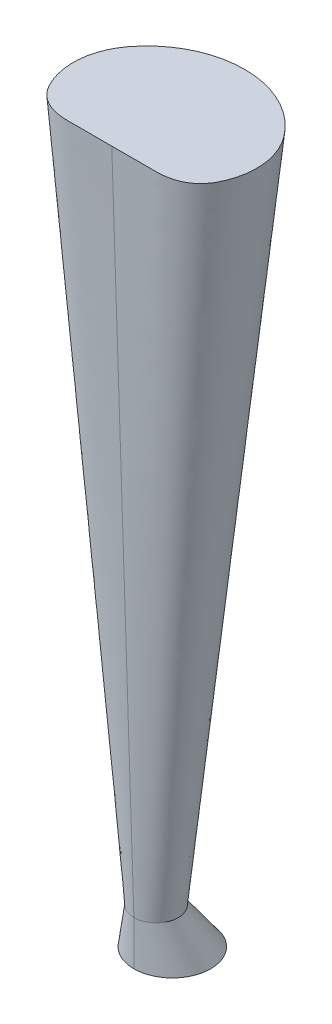
ISO-10303-21;
HEADER;
FILE_DESCRIPTION(('STEP AP214'),'2;1');
FILE_NAME('part.step','',(''),(''),'','','');
FILE_SCHEMA(('AUTOMOTIVE_DESIGN { 1 0 10303 214 1 1 1 1 }'));
ENDSEC;
DATA;
#1=APPLICATION_CONTEXT('core data for automotive mechanical design processes');
#2=APPLICATION_PROTOCOL_DEFINITION('international standard','automotive_design',2000,#1);
#3=PRODUCT_CONTEXT('',#1,'mechanical');
#4=PRODUCT('Part','Part','',(#3));
#5=PRODUCT_RELATED_PRODUCT_CATEGORY('part','',(#4));
#6=PRODUCT_DEFINITION_FORMATION('','',#4);
#7=PRODUCT_DEFINITION_CONTEXT('part definition',#1,'design');
#8=PRODUCT_DEFINITION('design','',#6,#7);
#9=PRODUCT_DEFINITION_SHAPE('','',#8);
#10=(LENGTH_UNIT() NAMED_UNIT(*) SI_UNIT(.MILLI.,.METRE.));
#11=(NAMED_UNIT(*) PLANE_ANGLE_UNIT() SI_UNIT($,.RADIAN.));
#12=(NAMED_UNIT(*) SI_UNIT($,.STERADIAN.) SOLID_ANGLE_UNIT());
#13=UNCERTAINTY_MEASURE_WITH_UNIT(LENGTH_MEASURE(1.E-05),#10,'distance_accuracy_value','');
#14=(GEOMETRIC_REPRESENTATION_CONTEXT(3) GLOBAL_UNCERTAINTY_ASSIGNED_CONTEXT((#13)) GLOBAL_UNIT_ASSIGNED_CONTEXT((#10,
#11,#12)) REPRESENTATION_CONTEXT('',''));
#15=CARTESIAN_POINT('',(0.,0.,0.));
#16=DIRECTION('',(0.,0.,1.));
#17=DIRECTION('',(1.,0.,0.));
#18=AXIS2_PLACEMENT_3D('',#15,#16,#17);
#19=CARTESIAN_POINT('',(66.8999862803839,273.793581868622,-23.9760529932259));
#20=DIRECTION('',(0.,1.,0.));
#21=DIRECTION('',(0.,0.,1.));
#22=AXIS2_PLACEMENT_3D('',#19,#20,#21);
#23=PLANE('',#22);
#24=DIRECTION('',(1.,0.,0.));
#25=VECTOR('',#24,1.);
#26=CARTESIAN_POINT('',(-1.37196160818359E-05,273.793581868622,65.2239470067741));
#27=LINE('',#26,#25);
#28=CARTESIAN_POINT('',(-1.37196160818359E-05,273.793581868622,65.2239470067741));
#29=VERTEX_POINT('',#28);
#30=CARTESIAN_POINT('',(66.8999862804511,273.793581868622,65.2239470067741));
#31=VERTEX_POINT('',#30);
#32=EDGE_CURVE('E496',#29,#31,#27,.T.);
#33=ORIENTED_EDGE('',*,*,#32,.T.);
#34=CARTESIAN_POINT('',(66.8999862803839,273.793581868622,-23.9760529932259));
#35=DIRECTION('',(0.,1.,0.));
#36=DIRECTION('',(0.,0.,1.));
#37=AXIS2_PLACEMENT_3D('',#34,#35,#36);
#38=CIRCLE('',#37,89.2);
#39=CARTESIAN_POINT('',(90.6681218430752,273.793581868622,61.9990348629289));
#40=VERTEX_POINT('',#39);
#41=EDGE_CURVE('E170',#31,#40,#38,.T.);
#42=ORIENTED_EDGE('',*,*,#41,.T.);
#43=CARTESIAN_POINT('',(75.218833727268,273.793581868622,6.11522775644428));
#44=DIRECTION('',(0.,1.,0.));
#45=DIRECTION('',(0.,0.,1.));
#46=AXIS2_PLACEMENT_3D('',#43,#44,#45);
#47=CIRCLE('',#46,57.98);
#48=CARTESIAN_POINT('',(126.250033132228,273.793581868622,33.6378927308106));
#49=VERTEX_POINT('',#48);
#50=EDGE_CURVE('E176',#40,#49,#47,.T.);
#51=ORIENTED_EDGE('',*,*,#50,.T.);
#52=CARTESIAN_POINT('',(35.964064954307,273.793581868622,-15.0560529932259));
#53=DIRECTION('',(0.,1.,0.));
#54=DIRECTION('',(0.,0.,1.));
#55=AXIS2_PLACEMENT_3D('',#52,#53,#54);
#56=CIRCLE('',#55,102.58);
#57=CARTESIAN_POINT('',(118.028537187502,273.793581868622,-76.6034233439338));
#58=VERTEX_POINT('',#57);
#59=EDGE_CURVE('E470',#49,#58,#56,.T.);
#60=ORIENTED_EDGE('',*,*,#59,.T.);
#61=CARTESIAN_POINT('',(0.283859635532339,273.793581868622,11.7036732462201));
#62=DIRECTION('',(0.,1.,0.));
#63=DIRECTION('',(0.,0.,1.));
#64=AXIS2_PLACEMENT_3D('',#61,#62,#63);
#65=CIRCLE('',#64,147.18);
#66=CARTESIAN_POINT('',(-1.37196160816901E-05,273.793581868622,-135.476052993226));
#67=VERTEX_POINT('',#66);
#68=EDGE_CURVE('E231',#58,#67,#65,.T.);
#69=ORIENTED_EDGE('',*,*,#68,.T.);
#70=CARTESIAN_POINT('',(-0.283887074764503,273.793581868622,11.7036732462201));
#71=DIRECTION('',(0.,-1.,0.));
#72=DIRECTION('',(0.,0.,1.));
#73=AXIS2_PLACEMENT_3D('',#70,#71,#72);
#74=CIRCLE('',#73,147.18);
#75=CARTESIAN_POINT('',(-118.028564626734,273.793581868622,-76.6034233439338));
#76=VERTEX_POINT('',#75);
#77=EDGE_CURVE('E155',#76,#67,#74,.T.);
#78=ORIENTED_EDGE('',*,*,#77,.F.);
#79=CARTESIAN_POINT('',(-35.9640923935392,273.793581868622,-15.0560529932259));
#80=DIRECTION('',(0.,-1.,0.));
#81=DIRECTION('',(0.,0.,1.));
#82=AXIS2_PLACEMENT_3D('',#79,#80,#81);
#83=CIRCLE('',#82,102.58);
#84=CARTESIAN_POINT('',(-126.25006057146,273.793581868622,33.6378927308106));
#85=VERTEX_POINT('',#84);
#86=EDGE_CURVE('E214',#85,#76,#83,.T.);
#87=ORIENTED_EDGE('',*,*,#86,.F.);
#88=CARTESIAN_POINT('',(-75.2188611665002,273.793581868622,6.11522775644428));
#89=DIRECTION('',(0.,-1.,0.));
#90=DIRECTION('',(0.,0.,1.));
#91=AXIS2_PLACEMENT_3D('',#88,#89,#90);
#92=CIRCLE('',#91,57.98);
#93=CARTESIAN_POINT('',(-90.6681492823074,273.793581868622,61.9990348629289));
#94=VERTEX_POINT('',#93);
#95=EDGE_CURVE('E221',#94,#85,#92,.T.);
#96=ORIENTED_EDGE('',*,*,#95,.F.);
#97=CARTESIAN_POINT('',(-66.9000137196161,273.793581868622,-23.9760529932259));
#98=DIRECTION('',(0.,-1.,0.));
#99=DIRECTION('',(0.,0.,1.));
#100=AXIS2_PLACEMENT_3D('',#97,#98,#99);
#101=CIRCLE('',#100,89.2);
#102=CARTESIAN_POINT('',(-66.9000137196833,273.793581868622,65.2239470067741));
#103=VERTEX_POINT('',#102);
#104=EDGE_CURVE('E310',#103,#94,#101,.T.);
#105=ORIENTED_EDGE('',*,*,#104,.F.);
#106=DIRECTION('',(-1.,0.,0.));
#107=VECTOR('',#106,1.);
#108=CARTESIAN_POINT('',(-1.37196160818359E-05,273.793581868622,65.2239470067741));
#109=LINE('',#108,#107);
#110=EDGE_CURVE('E312',#29,#103,#109,.T.);
#111=ORIENTED_EDGE('',*,*,#110,.F.);
#112=EDGE_LOOP('',(#33,#42,#51,#60,#69,#78,#87,#96,#105,#111));
#113=FACE_BOUND('',#112,.T.);
#114=ADVANCED_FACE('F148',(#113),#23,.T.);
#115=CARTESIAN_POINT('',(-1.37196160352938E-05,273.793581868622,-135.476052993226));
#116=CARTESIAN_POINT('',(-1.37196160493937E-05,-68.1397514647116,-102.026052993226));
#117=CARTESIAN_POINT('',(-1.37196160634937E-05,-410.073084798045,-68.5760529932258));
#118=CARTESIAN_POINT('',(-1.37196160775936E-05,-752.006418131378,-35.1260529932259));
#119=CARTESIAN_POINT('',(11.3311433671293,273.793581868622,-135.49790799773));
#120=CARTESIAN_POINT('',(8.57678876781603,-68.1397514647116,-102.040622996229));
#121=CARTESIAN_POINT('',(5.82243416850271,-410.073084798045,-68.5833379947273));
#122=CARTESIAN_POINT('',(3.0680795691894,-752.006418131378,-35.1260529932259));
#123=CARTESIAN_POINT('',(34.0417888206109,273.793581868622,-132.913472028035));
#124=CARTESIAN_POINT('',(25.7582200293779,-68.1397514647111,-100.034719431692));
#125=CARTESIAN_POINT('',(17.4746512381449,-410.073084798044,-67.1559668353496));
#126=CARTESIAN_POINT('',(9.19108244691192,-752.006418131377,-34.277214239007));
#127=CARTESIAN_POINT('',(66.4079721648676,273.793581868622,-121.274765211516));
#128=CARTESIAN_POINT('',(50.1582694705045,-68.1397514647118,-91.0422536483371));
#129=CARTESIAN_POINT('',(33.9085667761413,-410.073084798045,-60.8097420851581));
#130=CARTESIAN_POINT('',(17.6588640817782,-752.006418131379,-30.577230521979));
#131=CARTESIAN_POINT('',(95.2952489551052,273.793581868622,-102.447436350555));
#132=CARTESIAN_POINT('',(71.7952216321531,-68.1397514647116,-76.5468436163779));
#133=CARTESIAN_POINT('',(48.2951943092009,-410.073084798045,-50.6462508822005));
#134=CARTESIAN_POINT('',(24.7951669862488,-752.006418131378,-24.7456581480232));
#135=CARTESIAN_POINT('',(111.16287052082,273.793581868622,-85.7577918948489));
#136=CARTESIAN_POINT('',(83.5494099573359,-68.1397514647116,-63.7486056513373));
#137=CARTESIAN_POINT('',(55.9359493938521,-410.073084798045,-41.7394194078256));
#138=CARTESIAN_POINT('',(28.3224888303683,-752.006418131378,-19.7302331643139));
#139=CARTESIAN_POINT('',(123.838312014108,273.793581868622,-68.8569330841193));
#140=CARTESIAN_POINT('',(92.8573933722614,-68.1397514647115,-50.8217575393254));
#141=CARTESIAN_POINT('',(61.8764747304147,-410.073084798045,-32.7865819945315));
#142=CARTESIAN_POINT('',(30.8955560885679,-752.006418131378,-14.7514064497376));
#143=CARTESIAN_POINT('',(133.287452347045,273.793581868622,-51.6551382452281));
#144=CARTESIAN_POINT('',(99.7643781421056,-68.1397514647113,-37.7473829894022));
#145=CARTESIAN_POINT('',(66.2413039371658,-410.073084798044,-23.8396277335764));
#146=CARTESIAN_POINT('',(32.718229732226,-752.006418131377,-9.93187247775053));
#147=CARTESIAN_POINT('',(139.656527412165,273.793581868622,-22.8049380532116));
#148=CARTESIAN_POINT('',(104.349898728126,-68.1397514647114,-15.9699412888925));
#149=CARTESIAN_POINT('',(69.0432700440865,-410.073084798045,-9.1349445245734));
#150=CARTESIAN_POINT('',(33.7366413600472,-752.006418131378,-2.29994776025429));
#151=CARTESIAN_POINT('',(137.646004848515,273.793581868622,6.67892031311046));
#152=CARTESIAN_POINT('',(102.76441101422,-68.1397514647117,6.24007273998973));
#153=CARTESIAN_POINT('',(67.8828171799246,-410.073084798045,5.80122516686901));
#154=CARTESIAN_POINT('',(33.0012233456295,-752.006418131379,5.36237759374827));
#155=CARTESIAN_POINT('',(130.850979370632,273.793581868622,25.1070398806269));
#156=CARTESIAN_POINT('',(97.687266980444,-68.1397514647115,20.1521173998432));
#157=CARTESIAN_POINT('',(64.5235545902562,-410.073084798045,15.1971949190596));
#158=CARTESIAN_POINT('',(31.3598422000684,-752.006418131378,10.2422724382759));
#159=CARTESIAN_POINT('',(124.38306104395,273.793581868622,37.0995424296404));
#160=CARTESIAN_POINT('',(92.863427979662,-68.1397514647116,29.2351436910575));
#161=CARTESIAN_POINT('',(61.3437949153742,-410.073084798045,21.3707449524745));
#162=CARTESIAN_POINT('',(29.8241618510864,-752.006418131378,13.5063462138916));
#163=CARTESIAN_POINT('',(119.957032736586,273.793581868622,43.6159100457143));
#164=CARTESIAN_POINT('',(89.5866961213363,-68.1397514647118,34.1961664945862));
#165=CARTESIAN_POINT('',(59.216359506086,-410.073084798045,24.7764229434582));
#166=CARTESIAN_POINT('',(28.8460228908357,-752.006418131379,15.3566793923301));
#167=CARTESIAN_POINT('',(111.536180387679,273.793581868622,51.8146732142196));
#168=CARTESIAN_POINT('',(83.3956034985308,-68.139751464711,40.5422477519083));
#169=CARTESIAN_POINT('',(55.2550266093827,-410.073084798044,29.2698222895969));
#170=CARTESIAN_POINT('',(27.1144497202346,-752.006418131377,17.9973968272856));
#171=CARTESIAN_POINT('',(101.679634650372,273.793581868622,58.144308131504));
#172=CARTESIAN_POINT('',(76.1644530270801,-68.1397514647121,45.5868515061092));
#173=CARTESIAN_POINT('',(50.6492714037881,-410.073084798046,33.0293948807144));
#174=CARTESIAN_POINT('',(25.1340897804962,-752.00641813138,20.4719382553196));
#175=CARTESIAN_POINT('',(94.4088129842258,273.793581868622,60.9649067642276));
#176=CARTESIAN_POINT('',(70.8263803927478,-68.1397514647116,47.9737527035807));
#177=CARTESIAN_POINT('',(47.2439478012698,-410.073084798045,34.9825986429338));
#178=CARTESIAN_POINT('',(23.6615152097918,-752.006418131378,21.9914445822869));
#179=CARTESIAN_POINT('',(88.7207067929852,273.793581868622,62.5374050590078));
#180=CARTESIAN_POINT('',(66.6438925430318,-68.1397514647116,49.3885053238324));
#181=CARTESIAN_POINT('',(44.5670782930784,-410.073084798045,36.2396055886571));
#182=CARTESIAN_POINT('',(22.490264043125,-752.006418131378,23.0907058534817));
#183=CARTESIAN_POINT('',(84.8034479604527,273.793581868622,63.4779635368731));
#184=CARTESIAN_POINT('',(63.7578533030439,-68.1397514647117,50.2607924779817));
#185=CARTESIAN_POINT('',(42.712258645635,-410.073084798045,37.0436214190904));
#186=CARTESIAN_POINT('',(21.6666639882262,-752.006418131379,23.826450360199));
#187=CARTESIAN_POINT('',(78.8736420986773,273.793581868622,64.4846153237049));
#188=CARTESIAN_POINT('',(59.3729337887988,-68.1397514647115,51.2806041980256));
#189=CARTESIAN_POINT('',(39.8722254789204,-410.073084798045,38.0765930723464));
#190=CARTESIAN_POINT('',(20.3715171690419,-752.006418131378,24.8725819466671));
#191=CARTESIAN_POINT('',(72.9025530483503,273.793581868622,65.0891093195945));
#192=CARTESIAN_POINT('',(54.9425865325908,-68.1397514647113,52.0111371435507));
#193=CARTESIAN_POINT('',(36.9826200168313,-410.073084798044,38.933164967507));
#194=CARTESIAN_POINT('',(19.0226535010718,-752.006418131378,25.8551927914632));
#195=CARTESIAN_POINT('',(68.9027025361643,273.793581868622,65.2239470067741));
#196=CARTESIAN_POINT('',(51.9658472393102,-68.1397514647116,52.3040958479409));
#197=CARTESIAN_POINT('',(35.0289919424561,-410.073084798045,39.3842446891076));
#198=CARTESIAN_POINT('',(18.092136645602,-752.006418131378,26.4643935302743));
#199=CARTESIAN_POINT('',(61.3228043238573,273.793581868622,65.2239470067741));
#200=CARTESIAN_POINT('',(46.3173065428685,-68.1397514647116,52.6729977524665));
#201=CARTESIAN_POINT('',(31.3118087618796,-410.073084798045,40.1220484981588));
#202=CARTESIAN_POINT('',(16.3063109808908,-752.006418131378,27.5710992438512));
#203=CARTESIAN_POINT('',(50.2030963591511,273.793581868622,65.2239470067741));
#204=CARTESIAN_POINT('',(37.9874877218089,-68.1397514647116,53.1567887606828));
#205=CARTESIAN_POINT('',(25.7718790844666,-410.073084798045,41.0896305145914));
#206=CARTESIAN_POINT('',(13.5562704471243,-752.006418131378,29.0224722685001));
#207=CARTESIAN_POINT('',(33.5517417571939,273.793581868622,65.2239470067741));
#208=CARTESIAN_POINT('',(25.42130826238,-68.1397514647114,53.6852259519735));
#209=CARTESIAN_POINT('',(17.2908747675661,-410.073084798045,42.1465048971728));
#210=CARTESIAN_POINT('',(9.16044127275213,-752.006418131378,30.6077838423722));
#211=CARTESIAN_POINT('',(16.8542182947564,273.793581868622,65.2239470067741));
#212=CARTESIAN_POINT('',(12.7698785357626,-68.1397514647116,54.0040160673594));
#213=CARTESIAN_POINT('',(8.68553877676883,-410.073084798045,42.7840851279448));
#214=CARTESIAN_POINT('',(4.60119901777504,-752.006418131378,31.5641541885301));
#215=CARTESIAN_POINT('',(5.64083408733317,273.793581868622,65.2239470067741));
#216=CARTESIAN_POINT('',(4.26966733210024,-68.1397514647116,54.0739470067741));
#217=CARTESIAN_POINT('',(2.89850057686731,-410.073084798045,42.9239470067741));
#218=CARTESIAN_POINT('',(1.52733382163438,-752.006418131378,31.7739470067741));
#219=CARTESIAN_POINT('',(-1.37196160818359E-05,273.793581868622,65.2239470067741));
#220=CARTESIAN_POINT('',(-1.37196160778008E-05,-68.1397514647116,54.0739470067741));
#221=CARTESIAN_POINT('',(-1.37196160737658E-05,-410.073084798045,42.9239470067741));
#222=CARTESIAN_POINT('',(-1.37196160697307E-05,-752.006418131378,31.7739470067741));
#223=B_SPLINE_SURFACE_WITH_KNOTS('',3,3,((#115,#116,#117,#118),(#119,#120,#121,#122),(#123,#124,
#125,#126),(#127,#128,#129,#130),(#131,#132,#133,#134),(#135,#136,#137,#138),(#139,#140,#141,
#142),(#143,#144,#145,#146),(#147,#148,#149,#150),(#151,#152,#153,#154),(#155,#156,#157,#158),
(#159,#160,#161,#162),(#163,#164,#165,#166),(#167,#168,#169,#170),(#171,#172,#173,#174),(#175,
#176,#177,#178),(#179,#180,#181,#182),(#183,#184,#185,#186),(#187,#188,#189,#190),(#191,#192,
#193,#194),(#195,#196,#197,#198),(#199,#200,#201,#202),(#203,#204,#205,#206),(#207,#208,#209,
#210),(#211,#212,#213,#214),(#215,#216,#217,#218),(#219,#220,#221,#222)),.UNSPECIFIED.,.F.,.F.,
.F.,(4,1,1,1,2,1,1,1,2,1,1,1,2,1,1,1,2,1,1,1,4),(4,4),(0.,0.0872247546886241,0.174449509377248,
0.261674264065872,0.348899018754496,0.422709212009021,0.496519405263545,0.57032959851807,
0.644139791772594,0.674090493965362,0.704041196158131,0.733991898350899,0.763942600543667,
0.77953502602496,0.795127451506254,0.810719876987548,0.826312302468841,0.869734226851631,
0.913156151234421,0.95657807561721,1.),(0.,1.),.UNSPECIFIED.);
#224=DIRECTION('',(0.,-0.999468760107714,-0.0325913726122081));
#225=VECTOR('',#224,1.);
#226=CARTESIAN_POINT('',(-1.37196160757833E-05,-239.106418131378,48.4989470067741));
#227=LINE('',#226,#225);
#228=CARTESIAN_POINT('',(-1.3719616093941E-05,-752.006418131378,31.7739470067741));
#229=VERTEX_POINT('',#228);
#230=EDGE_CURVE('E162',#29,#229,#227,.T.);
#231=CARTESIAN_POINT('',(-1.37196160816901E-05,-752.006418131378,-1.67605299322587));
#232=DIRECTION('',(0.,1.,0.));
#233=DIRECTION('',(0.,0.,1.));
#234=AXIS2_PLACEMENT_3D('',#231,#232,#233);
#235=CIRCLE('',#234,33.45);
#236=CARTESIAN_POINT('',(-1.37196160816901E-05,-752.006418131378,-35.1260529932259));
#237=VERTEX_POINT('',#236);
#238=EDGE_CURVE('E13',#229,#237,#235,.T.);
#239=DIRECTION('',(0.,0.995249100668526,-0.0973613250653993));
#240=VECTOR('',#239,1.);
#241=CARTESIAN_POINT('',(-1.37196160564437E-05,-239.106418131378,-85.3010529932258));
#242=LINE('',#241,#240);
#243=EDGE_CURVE('E453',#237,#67,#242,.T.);
#244=ORIENTED_EDGE('',*,*,#68,.F.);
#245=ORIENTED_EDGE('',*,*,#59,.F.);
#246=ORIENTED_EDGE('',*,*,#50,.F.);
#247=ORIENTED_EDGE('',*,*,#41,.F.);
#248=ORIENTED_EDGE('',*,*,#32,.F.);
#249=ORIENTED_EDGE('',*,*,#230,.T.);
#250=ORIENTED_EDGE('',*,*,#238,.T.);
#251=ORIENTED_EDGE('',*,*,#243,.T.);
#252=EDGE_LOOP('',(#244,#245,#246,#247,#248,#249,#250,#251));
#253=FACE_BOUND('',#252,.T.);
#254=ADVANCED_FACE('F150',(#253),#223,.T.);
#255=CARTESIAN_POINT('',(-1.37196160816901E-05,-818.906418131378,-26.2060529932259));
#256=DIRECTION('',(0.,1.,0.));
#257=DIRECTION('',(0.,0.,1.));
#258=AXIS2_PLACEMENT_3D('',#255,#256,#257);
#259=PLANE('',#258);
#260=CARTESIAN_POINT('',(-1.37196160697307E-05,-818.906418131378,31.7739470067741));
#261=CARTESIAN_POINT('',(2.41581961371727,-818.906418131378,31.7739470067741));
#262=CARTESIAN_POINT('',(4.98414426717486,-818.906418131378,31.6241044192575));
#263=CARTESIAN_POINT('',(10.4087486475753,-818.906418131378,30.8975949040253));
#264=CARTESIAN_POINT('',(13.2658102803839,-818.906418131379,30.3205816734408));
#265=CARTESIAN_POINT('',(19.2029622803839,-818.906418131379,28.5889123401075));
#266=CARTESIAN_POINT('',(22.2838452207534,-818.906418131379,27.433315773344));
#267=CARTESIAN_POINT('',(28.5300599242841,-818.906418131379,24.3882861053728));
#268=CARTESIAN_POINT('',(31.6957196137173,-818.906418131379,22.4971470067741));
#269=CARTESIAN_POINT('',(37.8802529470506,-818.906418131379,17.8587470067741));
#270=CARTESIAN_POINT('',(40.8982448654843,-818.906418131378,15.1092757113466));
#271=CARTESIAN_POINT('',(46.4688509829548,-818.906418131378,8.72628953507837));
#272=CARTESIAN_POINT('',(49.0188328778465,-818.906418131379,5.0911096365319));
#273=CARTESIAN_POINT('',(53.2987867417449,-818.906418131378,-2.93380385827778));
#274=CARTESIAN_POINT('',(55.024950382948,-818.906418131378,-7.32309914707204));
#275=CARTESIAN_POINT('',(57.3670221778198,-818.906418131378,-16.5450068393797));
#276=CARTESIAN_POINT('',(57.979986280384,-818.906418131379,-21.3743863265592));
#277=CARTESIAN_POINT('',(57.9799862803839,-818.906418131378,-31.0377196598925));
#278=CARTESIAN_POINT('',(57.3670221778198,-818.906418131378,-35.8670991470721));
#279=CARTESIAN_POINT('',(55.024950382948,-818.906418131378,-45.0890068393797));
#280=CARTESIAN_POINT('',(53.2987867417449,-818.906418131378,-49.478302128174));
#281=CARTESIAN_POINT('',(49.0188328778465,-818.906418131379,-57.5032156229837));
#282=CARTESIAN_POINT('',(46.4688509829548,-818.906418131378,-61.1383955215301));
#283=CARTESIAN_POINT('',(40.8982448654843,-818.906418131378,-67.5213816977983));
#284=CARTESIAN_POINT('',(37.8802529470506,-818.906418131378,-70.2708529932259));
#285=CARTESIAN_POINT('',(31.6957196137173,-818.906418131379,-74.9092529932259));
#286=CARTESIAN_POINT('',(28.5300599242841,-818.906418131378,-76.8003920918245));
#287=CARTESIAN_POINT('',(22.2838452207534,-818.906418131379,-79.8454217597958));
#288=CARTESIAN_POINT('',(19.2029622803839,-818.906418131379,-81.0010183265593));
#289=CARTESIAN_POINT('',(13.2658102803839,-818.906418131379,-82.7326876598926));
#290=CARTESIAN_POINT('',(10.4087486475753,-818.906418131378,-83.309700890477));
#291=CARTESIAN_POINT('',(4.98414426717485,-818.906418131378,-84.0362104057093));
#292=CARTESIAN_POINT('',(2.41581961371726,-818.906418131378,-84.1860529932259));
#293=CARTESIAN_POINT('',(-1.37196160745896E-05,-818.906418131378,-84.1860529932259));
#294=B_SPLINE_CURVE_WITH_KNOTS('',3,(#260,#261,#262,#263,#264,#265,#266,#267,#268,#269,#270,
#271,#272,#273,#274,#275,#276,#277,#278,#279,#280,#281,#282,#283,#284,#285,#286,#287,#288,#289,
#290,#291,#292,#293),.UNSPECIFIED.,.F.,.F.,(4,2,2,2,2,2,2,2,2,2,2,2,2,2,2,2,4),(0.,
0.0625000000000001,0.125,0.1875,0.25,0.3125,0.375,0.4375,0.5,0.5625,0.625,0.6875,0.75,0.8125,
0.875,0.9375,1.),.UNSPECIFIED.);
#295=CARTESIAN_POINT('',(-1.37196160697307E-05,-818.906418131378,31.7739470067741));
#296=VERTEX_POINT('',#295);
#297=CARTESIAN_POINT('',(-1.37196160816901E-05,-818.906418131378,-84.1860529932259));
#298=VERTEX_POINT('',#297);
#299=EDGE_CURVE('E398',#296,#298,#294,.T.);
#300=ORIENTED_EDGE('',*,*,#299,.F.);
#301=CARTESIAN_POINT('',(-1.37196160890821E-05,-818.906418131378,-84.1860529932259));
#302=CARTESIAN_POINT('',(-2.41584705294942,-818.906418131378,-84.1860529932259));
#303=CARTESIAN_POINT('',(-4.98417170640701,-818.906418131378,-84.0362104057093));
#304=CARTESIAN_POINT('',(-10.4087760868075,-818.906418131378,-83.309700890477));
#305=CARTESIAN_POINT('',(-13.2658377196161,-818.906418131379,-82.7326876598926));
#306=CARTESIAN_POINT('',(-19.2029897196161,-818.906418131379,-81.0010183265593));
#307=CARTESIAN_POINT('',(-22.2838726599856,-818.906418131379,-79.8454217597958));
#308=CARTESIAN_POINT('',(-28.5300873635163,-818.906418131378,-76.8003920918245));
#309=CARTESIAN_POINT('',(-31.6957470529494,-818.906418131379,-74.9092529932259));
#310=CARTESIAN_POINT('',(-37.8802803862827,-818.906418131378,-70.2708529932259));
#311=CARTESIAN_POINT('',(-40.8982723047165,-818.906418131378,-67.5213816977983));
#312=CARTESIAN_POINT('',(-46.4688784221869,-818.906418131378,-61.1383955215301));
#313=CARTESIAN_POINT('',(-49.0188603170786,-818.906418131379,-57.5032156229837));
#314=CARTESIAN_POINT('',(-53.2988141809771,-818.906418131378,-49.478302128174));
#315=CARTESIAN_POINT('',(-55.0249778221802,-818.906418131378,-45.0890068393797));
#316=CARTESIAN_POINT('',(-57.367049617052,-818.906418131378,-35.8670991470721));
#317=CARTESIAN_POINT('',(-57.9800137196161,-818.906418131378,-31.0377196598925));
#318=CARTESIAN_POINT('',(-57.9800137196161,-818.906418131379,-21.3743863265592));
#319=CARTESIAN_POINT('',(-57.367049617052,-818.906418131378,-16.5450068393797));
#320=CARTESIAN_POINT('',(-55.0249778221802,-818.906418131378,-7.32309914707204));
#321=CARTESIAN_POINT('',(-53.2988141809771,-818.906418131378,-2.93380385827778));
#322=CARTESIAN_POINT('',(-49.0188603170786,-818.906418131379,5.0911096365319));
#323=CARTESIAN_POINT('',(-46.4688784221869,-818.906418131378,8.72628953507837));
#324=CARTESIAN_POINT('',(-40.8982723047165,-818.906418131378,15.1092757113466));
#325=CARTESIAN_POINT('',(-37.8802803862828,-818.906418131379,17.8587470067741));
#326=CARTESIAN_POINT('',(-31.6957470529494,-818.906418131379,22.4971470067741));
#327=CARTESIAN_POINT('',(-28.5300873635163,-818.906418131379,24.3882861053728));
#328=CARTESIAN_POINT('',(-22.2838726599856,-818.906418131379,27.433315773344));
#329=CARTESIAN_POINT('',(-19.2029897196161,-818.906418131379,28.5889123401075));
#330=CARTESIAN_POINT('',(-13.2658377196161,-818.906418131379,30.3205816734408));
#331=CARTESIAN_POINT('',(-10.4087760868075,-818.906418131378,30.8975949040253));
#332=CARTESIAN_POINT('',(-4.98417170640702,-818.906418131378,31.6241044192575));
#333=CARTESIAN_POINT('',(-2.41584705294943,-818.906418131378,31.7739470067741));
#334=CARTESIAN_POINT('',(-1.3719616093941E-05,-818.906418131378,31.7739470067741));
#335=B_SPLINE_CURVE_WITH_KNOTS('',3,(#301,#302,#303,#304,#305,#306,#307,#308,#309,#310,#311,
#312,#313,#314,#315,#316,#317,#318,#319,#320,#321,#322,#323,#324,#325,#326,#327,#328,#329,#330,
#331,#332,#333,#334),.UNSPECIFIED.,.F.,.F.,(4,2,2,2,2,2,2,2,2,2,2,2,2,2,2,2,4),(0.,0.0625,0.125,
0.1875,0.25,0.3125,0.375,0.4375,0.5,0.5625,0.625,0.6875,0.75,0.8125,0.875,0.9375,1.),.UNSPECIFIED.);
#336=EDGE_CURVE('E320',#296,#298,#335,.F.);
#337=ORIENTED_EDGE('',*,*,#336,.T.);
#338=EDGE_LOOP('',(#300,#337));
#339=FACE_BOUND('',#338,.T.);
#340=ADVANCED_FACE('F345',(#339),#259,.F.);
#341=CARTESIAN_POINT('',(-1.37196160697307E-05,-818.906418131378,31.7739470067741));
#342=CARTESIAN_POINT('',(-1.37196160697307E-05,-752.006418131378,31.7739470067741));
#343=CARTESIAN_POINT('',(2.41581961371727,-818.906418131378,31.7739470067741));
#344=CARTESIAN_POINT('',(1.39373628038393,-752.006418131378,31.7739470067741));
#345=CARTESIAN_POINT('',(4.98414426717486,-818.906418131378,31.6241044192575));
#346=CARTESIAN_POINT('',(2.87891628038393,-752.006418131378,31.6892070067741));
#347=CARTESIAN_POINT('',(10.4087486475753,-818.906418131378,30.8975949040253));
#348=CARTESIAN_POINT('',(6.00872128038394,-752.006418131378,31.2699670067741));
#349=CARTESIAN_POINT('',(13.2658102803839,-818.906418131379,30.3205816734408));
#350=CARTESIAN_POINT('',(7.65334628038393,-752.006418131378,30.9354670067741));
#351=CARTESIAN_POINT('',(19.2029622803839,-818.906418131379,28.5889123401075));
#352=CARTESIAN_POINT('',(11.0786262803839,-752.006418131378,29.9364270067741));
#353=CARTESIAN_POINT('',(22.2838452207534,-818.906418131379,27.433315773344));
#354=CARTESIAN_POINT('',(12.8560587459817,-752.006418131378,29.2697366797952));
#355=CARTESIAN_POINT('',(28.5300599242841,-818.906418131379,24.3882861053728));
#356=CARTESIAN_POINT('',(16.4596441518648,-752.006418131378,27.5129887944272));
#357=CARTESIAN_POINT('',(31.6957196137173,-818.906418131379,22.4971470067741));
#358=CARTESIAN_POINT('',(18.2859862803839,-752.006418131379,26.4219470067741));
#359=CARTESIAN_POINT('',(37.8802529470506,-818.906418131379,17.8587470067741));
#360=CARTESIAN_POINT('',(21.8539862803839,-752.006418131379,23.7459470067741));
#361=CARTESIAN_POINT('',(40.8982448654843,-818.906418131378,15.1092757113466));
#362=CARTESIAN_POINT('',(23.5951354640957,-752.006418131378,22.1597135671044));
#363=CARTESIAN_POINT('',(46.4688509829548,-818.906418131378,8.72628953507837));
#364=CARTESIAN_POINT('',(26.8089466857133,-752.006418131378,18.4772215423343));
#365=CARTESIAN_POINT('',(49.0188328778465,-818.906418131379,5.0911096365319));
#366=CARTESIAN_POINT('',(28.2800900866123,-752.006418131379,16.3800023700959));
#367=CARTESIAN_POINT('',(53.2987867417449,-818.906418131378,-2.93380385827778));
#368=CARTESIAN_POINT('',(30.7492942388614,-752.006418131378,11.7502445846288));
#369=CARTESIAN_POINT('',(55.024950382948,-818.906418131378,-7.32309914707204));
#370=CARTESIAN_POINT('',(31.7451578780171,-752.006418131378,9.21795884109365));
#371=CARTESIAN_POINT('',(57.3670221778198,-818.906418131378,-16.5450068393797));
#372=CARTESIAN_POINT('',(33.0963531442892,-752.006418131378,3.89762748014693));
#373=CARTESIAN_POINT('',(57.979986280384,-818.906418131379,-21.3743863265592));
#374=CARTESIAN_POINT('',(33.4499862803839,-752.006418131378,1.11144700677412));
#375=CARTESIAN_POINT('',(57.9799862803839,-818.906418131378,-31.0377196598925));
#376=CARTESIAN_POINT('',(33.4499862803839,-752.006418131378,-4.46355299322589));
#377=CARTESIAN_POINT('',(57.3670221778198,-818.906418131378,-35.8670991470721));
#378=CARTESIAN_POINT('',(33.0963531442892,-752.006418131378,-7.24973346659866));
#379=CARTESIAN_POINT('',(55.024950382948,-818.906418131378,-45.0890068393797));
#380=CARTESIAN_POINT('',(31.745157878017,-752.006418131378,-12.5700648275454));
#381=CARTESIAN_POINT('',(53.2987867417449,-818.906418131378,-49.478302128174));
#382=CARTESIAN_POINT('',(30.7492942388614,-752.006418131378,-15.1023505710805));
#383=CARTESIAN_POINT('',(49.0188328778465,-818.906418131379,-57.5032156229837));
#384=CARTESIAN_POINT('',(28.2800900866123,-752.006418131378,-19.7321083565476));
#385=CARTESIAN_POINT('',(46.4688509829548,-818.906418131378,-61.1383955215301));
#386=CARTESIAN_POINT('',(26.8089466857132,-752.006418131378,-21.829327528786));
#387=CARTESIAN_POINT('',(40.8982448654843,-818.906418131378,-67.5213816977983));
#388=CARTESIAN_POINT('',(23.5951354640957,-752.006418131378,-25.5118195535561));
#389=CARTESIAN_POINT('',(37.8802529470506,-818.906418131378,-70.2708529932259));
#390=CARTESIAN_POINT('',(21.8539862803839,-752.006418131378,-27.0980529932259));
#391=CARTESIAN_POINT('',(31.6957196137173,-818.906418131379,-74.9092529932259));
#392=CARTESIAN_POINT('',(18.2859862803839,-752.006418131379,-29.7740529932259));
#393=CARTESIAN_POINT('',(28.5300599242841,-818.906418131378,-76.8003920918245));
#394=CARTESIAN_POINT('',(16.4596441518648,-752.006418131378,-30.865094780879));
#395=CARTESIAN_POINT('',(22.2838452207534,-818.906418131379,-79.8454217597958));
#396=CARTESIAN_POINT('',(12.8560587459817,-752.006418131378,-32.621842666247));
#397=CARTESIAN_POINT('',(19.2029622803839,-818.906418131379,-81.0010183265593));
#398=CARTESIAN_POINT('',(11.0786262803839,-752.006418131378,-33.2885329932259));
#399=CARTESIAN_POINT('',(13.2658102803839,-818.906418131379,-82.7326876598926));
#400=CARTESIAN_POINT('',(7.65334628038392,-752.006418131378,-34.2875729932259));
#401=CARTESIAN_POINT('',(10.4087486475753,-818.906418131378,-83.309700890477));
#402=CARTESIAN_POINT('',(6.00872128038392,-752.006418131378,-34.6220729932259));
#403=CARTESIAN_POINT('',(4.98414426717485,-818.906418131378,-84.0362104057093));
#404=CARTESIAN_POINT('',(2.87891628038392,-752.006418131378,-35.0413129932259));
#405=CARTESIAN_POINT('',(2.41581961371726,-818.906418131378,-84.1860529932259));
#406=CARTESIAN_POINT('',(1.39373628038392,-752.006418131378,-35.1260529932259));
#407=CARTESIAN_POINT('',(-1.37196160745896E-05,-818.906418131378,-84.1860529932259));
#408=CARTESIAN_POINT('',(-1.37196160775936E-05,-752.006418131378,-35.1260529932259));
#409=B_SPLINE_SURFACE_WITH_KNOTS('',3,1,((#341,#342),(#343,#344),(#345,#346),(#347,#348),(#349,
#350),(#351,#352),(#353,#354),(#355,#356),(#357,#358),(#359,#360),(#361,#362),(#363,#364),(#365,
#366),(#367,#368),(#369,#370),(#371,#372),(#373,#374),(#375,#376),(#377,#378),(#379,#380),(#381,
#382),(#383,#384),(#385,#386),(#387,#388),(#389,#390),(#391,#392),(#393,#394),(#395,#396),(#397,
#398),(#399,#400),(#401,#402),(#403,#404),(#405,#406),(#407,#408)),.UNSPECIFIED.,.F.,.F.,.F.,(4,
2,2,2,2,2,2,2,2,2,2,2,2,2,2,2,4),(2,2),(0.,0.0625000000000001,0.125,0.1875,0.25,0.3125,0.375,
0.4375,0.5,0.5625,0.625,0.6875,0.75,0.8125,0.875,0.9375,1.),(0.,1.),.UNSPECIFIED.);
#410=CARTESIAN_POINT('',(-1.37196160745896E-05,-818.906418131378,-84.1860529932259));
#411=CARTESIAN_POINT('',(-1.37196160775936E-05,-752.006418131378,-35.1260529932259));
#412=B_SPLINE_CURVE_WITH_KNOTS('',1,(#410,#411),.UNSPECIFIED.,.F.,.F.,(2,2),(0.,1.),.UNSPECIFIED.);
#413=EDGE_CURVE('E421',#298,#237,#412,.T.);
#414=CARTESIAN_POINT('',(-1.3719616093941E-05,-818.906418131378,31.7739470067741));
#415=CARTESIAN_POINT('',(-1.3719616093941E-05,-752.006418131378,31.7739470067741));
#416=B_SPLINE_CURVE_WITH_KNOTS('',1,(#414,#415),.UNSPECIFIED.,.F.,.F.,(2,2),(0.,1.),.UNSPECIFIED.);
#417=EDGE_CURVE('E431',#296,#229,#416,.T.);
#418=ORIENTED_EDGE('',*,*,#299,.T.);
#419=ORIENTED_EDGE('',*,*,#413,.T.);
#420=ORIENTED_EDGE('',*,*,#238,.F.);
#421=ORIENTED_EDGE('',*,*,#417,.F.);
#422=EDGE_LOOP('',(#418,#419,#420,#421));
#423=FACE_BOUND('',#422,.T.);
#424=ADVANCED_FACE('F251',(#423),#409,.T.);
#425=CARTESIAN_POINT('',(-1.37196161283779E-05,273.793581868622,-135.476052993226));
#426=CARTESIAN_POINT('',(-1.3719616114278E-05,-68.1397514647116,-102.026052993226));
#427=CARTESIAN_POINT('',(-1.3719616100178E-05,-410.073084798045,-68.5760529932258));
#428=CARTESIAN_POINT('',(-1.37196160860781E-05,-752.006418131378,-35.1260529932259));
#429=CARTESIAN_POINT('',(-11.3311708063615,273.793581868622,-135.49790799773));
#430=CARTESIAN_POINT('',(-8.57681620704819,-68.1397514647116,-102.040622996229));
#431=CARTESIAN_POINT('',(-5.82246160773488,-410.073084798045,-68.5833379947273));
#432=CARTESIAN_POINT('',(-3.06810700842156,-752.006418131378,-35.1260529932259));
#433=CARTESIAN_POINT('',(-34.0418162598431,273.793581868622,-132.913472028035));
#434=CARTESIAN_POINT('',(-25.7582474686101,-68.1397514647111,-100.034719431692));
#435=CARTESIAN_POINT('',(-17.4746786773771,-410.073084798044,-67.1559668353496));
#436=CARTESIAN_POINT('',(-9.19110988614408,-752.006418131377,-34.277214239007));
#437=CARTESIAN_POINT('',(-66.4079996040998,273.793581868622,-121.274765211516));
#438=CARTESIAN_POINT('',(-50.1582969097366,-68.1397514647118,-91.0422536483371));
#439=CARTESIAN_POINT('',(-33.9085942153735,-410.073084798045,-60.8097420851581));
#440=CARTESIAN_POINT('',(-17.6588915210103,-752.006418131379,-30.577230521979));
#441=CARTESIAN_POINT('',(-95.2952763943374,273.793581868622,-102.447436350555));
#442=CARTESIAN_POINT('',(-71.7952490713852,-68.1397514647116,-76.5468436163779));
#443=CARTESIAN_POINT('',(-48.2952217484331,-410.073084798045,-50.6462508822005));
#444=CARTESIAN_POINT('',(-24.7951944254809,-752.006418131378,-24.7456581480232));
#445=CARTESIAN_POINT('',(-111.162897960052,273.793581868622,-85.7577918948489));
#446=CARTESIAN_POINT('',(-83.5494373965681,-68.1397514647116,-63.7486056513373));
#447=CARTESIAN_POINT('',(-55.9359768330843,-410.073084798045,-41.7394194078256));
#448=CARTESIAN_POINT('',(-28.3225162696005,-752.006418131378,-19.7302331643139));
#449=CARTESIAN_POINT('',(-123.83833945334,273.793581868622,-68.8569330841193));
#450=CARTESIAN_POINT('',(-92.8574208114936,-68.1397514647115,-50.8217575393254));
#451=CARTESIAN_POINT('',(-61.8765021696469,-410.073084798045,-32.7865819945315));
#452=CARTESIAN_POINT('',(-30.8955835278001,-752.006418131378,-14.7514064497376));
#453=CARTESIAN_POINT('',(-133.287479786278,273.793581868622,-51.6551382452281));
#454=CARTESIAN_POINT('',(-99.7644055813378,-68.1397514647113,-37.7473829894022));
#455=CARTESIAN_POINT('',(-66.241331376398,-410.073084798044,-23.8396277335764));
#456=CARTESIAN_POINT('',(-32.7182571714581,-752.006418131377,-9.93187247775053));
#457=CARTESIAN_POINT('',(-139.656554851397,273.793581868622,-22.8049380532116));
#458=CARTESIAN_POINT('',(-104.349926167358,-68.1397514647114,-15.9699412888925));
#459=CARTESIAN_POINT('',(-69.0432974833187,-410.073084798045,-9.1349445245734));
#460=CARTESIAN_POINT('',(-33.7366687992794,-752.006418131378,-2.29994776025429));
#461=CARTESIAN_POINT('',(-137.646032287747,273.793581868622,6.67892031311046));
#462=CARTESIAN_POINT('',(-102.764438453452,-68.1397514647117,6.24007273998973));
#463=CARTESIAN_POINT('',(-67.8828446191568,-410.073084798045,5.80122516686901));
#464=CARTESIAN_POINT('',(-33.0012507848617,-752.006418131379,5.36237759374827));
#465=CARTESIAN_POINT('',(-130.851006809864,273.793581868622,25.1070398806269));
#466=CARTESIAN_POINT('',(-97.6872944196761,-68.1397514647115,20.1521173998432));
#467=CARTESIAN_POINT('',(-64.5235820294884,-410.073084798045,15.1971949190596));
#468=CARTESIAN_POINT('',(-31.3598696393006,-752.006418131378,10.2422724382759));
#469=CARTESIAN_POINT('',(-124.383088483182,273.793581868622,37.0995424296404));
#470=CARTESIAN_POINT('',(-92.8634554188941,-68.1397514647116,29.2351436910575));
#471=CARTESIAN_POINT('',(-61.3438223546064,-410.073084798045,21.3707449524745));
#472=CARTESIAN_POINT('',(-29.8241892903186,-752.006418131378,13.5063462138916));
#473=CARTESIAN_POINT('',(-119.957060175819,273.793581868622,43.6159100457143));
#474=CARTESIAN_POINT('',(-89.5867235605684,-68.1397514647118,34.1961664945862));
#475=CARTESIAN_POINT('',(-59.2163869453181,-410.073084798045,24.7764229434582));
#476=CARTESIAN_POINT('',(-28.8460503300679,-752.006418131379,15.3566793923301));
#477=CARTESIAN_POINT('',(-111.536207826911,273.793581868622,51.8146732142196));
#478=CARTESIAN_POINT('',(-83.3956309377629,-68.139751464711,40.5422477519083));
#479=CARTESIAN_POINT('',(-55.2550540486149,-410.073084798044,29.2698222895969));
#480=CARTESIAN_POINT('',(-27.1144771594668,-752.006418131377,17.9973968272856));
#481=CARTESIAN_POINT('',(-101.679662089604,273.793581868622,58.144308131504));
#482=CARTESIAN_POINT('',(-76.1644804663123,-68.1397514647121,45.5868515061092));
#483=CARTESIAN_POINT('',(-50.6492988430203,-410.073084798046,33.0293948807144));
#484=CARTESIAN_POINT('',(-25.1341172197283,-752.00641813138,20.4719382553196));
#485=CARTESIAN_POINT('',(-94.408840423458,273.793581868622,60.9649067642276));
#486=CARTESIAN_POINT('',(-70.82640783198,-68.1397514647116,47.9737527035807));
#487=CARTESIAN_POINT('',(-47.243975240502,-410.073084798045,34.9825986429338));
#488=CARTESIAN_POINT('',(-23.661542649024,-752.006418131378,21.9914445822869));
#489=CARTESIAN_POINT('',(-88.7207342322174,273.793581868622,62.5374050590078));
#490=CARTESIAN_POINT('',(-66.643919982264,-68.1397514647116,49.3885053238324));
#491=CARTESIAN_POINT('',(-44.5671057323106,-410.073084798045,36.2396055886571));
#492=CARTESIAN_POINT('',(-22.4902914823572,-752.006418131378,23.0907058534817));
#493=CARTESIAN_POINT('',(-84.8034753996849,273.793581868622,63.4779635368731));
#494=CARTESIAN_POINT('',(-63.7578807422761,-68.1397514647117,50.2607924779817));
#495=CARTESIAN_POINT('',(-42.7122860848672,-410.073084798045,37.0436214190904));
#496=CARTESIAN_POINT('',(-21.6666914274583,-752.006418131379,23.826450360199));
#497=CARTESIAN_POINT('',(-78.8736695379095,273.793581868622,64.4846153237049));
#498=CARTESIAN_POINT('',(-59.372961228031,-68.1397514647115,51.2806041980256));
#499=CARTESIAN_POINT('',(-39.8722529181526,-410.073084798045,38.0765930723464));
#500=CARTESIAN_POINT('',(-20.3715446082741,-752.006418131378,24.8725819466671));
#501=CARTESIAN_POINT('',(-72.9025804875824,273.793581868622,65.0891093195945));
#502=CARTESIAN_POINT('',(-54.942613971823,-68.1397514647113,52.0111371435507));
#503=CARTESIAN_POINT('',(-36.9826474560635,-410.073084798044,38.933164967507));
#504=CARTESIAN_POINT('',(-19.022680940304,-752.006418131378,25.8551927914632));
#505=CARTESIAN_POINT('',(-68.9027299753965,273.793581868622,65.2239470067741));
#506=CARTESIAN_POINT('',(-51.9658746785424,-68.1397514647116,52.3040958479409));
#507=CARTESIAN_POINT('',(-35.0290193816883,-410.073084798045,39.3842446891076));
#508=CARTESIAN_POINT('',(-18.0921640848342,-752.006418131378,26.4643935302743));
#509=CARTESIAN_POINT('',(-61.3228317630895,273.793581868622,65.2239470067741));
#510=CARTESIAN_POINT('',(-46.3173339821006,-68.1397514647116,52.6729977524665));
#511=CARTESIAN_POINT('',(-31.3118362011118,-410.073084798045,40.1220484981588));
#512=CARTESIAN_POINT('',(-16.306338420123,-752.006418131378,27.5710992438512));
#513=CARTESIAN_POINT('',(-50.2031237983833,273.793581868622,65.2239470067741));
#514=CARTESIAN_POINT('',(-37.987515161041,-68.1397514647116,53.1567887606828));
#515=CARTESIAN_POINT('',(-25.7719065236987,-410.073084798045,41.0896305145914));
#516=CARTESIAN_POINT('',(-13.5562978863565,-752.006418131378,29.0224722685001));
#517=CARTESIAN_POINT('',(-33.5517691964261,273.793581868622,65.2239470067741));
#518=CARTESIAN_POINT('',(-25.4213357016121,-68.1397514647114,53.6852259519735));
#519=CARTESIAN_POINT('',(-17.2909022067982,-410.073084798045,42.1465048971728));
#520=CARTESIAN_POINT('',(-9.1604687119843,-752.006418131378,30.6077838423722));
#521=CARTESIAN_POINT('',(-16.8542457339886,273.793581868622,65.2239470067741));
#522=CARTESIAN_POINT('',(-12.7699059749948,-68.1397514647116,54.0040160673594));
#523=CARTESIAN_POINT('',(-8.68556621600099,-410.073084798045,42.7840851279448));
#524=CARTESIAN_POINT('',(-4.6012264570072,-752.006418131378,31.5641541885301));
#525=CARTESIAN_POINT('',(-5.64086152656534,273.793581868622,65.2239470067741));
#526=CARTESIAN_POINT('',(-4.2696947713324,-68.1397514647116,54.0739470067741));
#527=CARTESIAN_POINT('',(-2.89852801609947,-410.073084798045,42.9239470067741));
#528=CARTESIAN_POINT('',(-1.52736126086654,-752.006418131378,31.7739470067741));
#529=CARTESIAN_POINT('',(-1.37196160818359E-05,273.793581868622,65.2239470067741));
#530=CARTESIAN_POINT('',(-1.37196160858709E-05,-68.1397514647116,54.0739470067741));
#531=CARTESIAN_POINT('',(-1.37196160899059E-05,-410.073084798045,42.9239470067741));
#532=CARTESIAN_POINT('',(-1.3719616093941E-05,-752.006418131378,31.7739470067741));
#533=B_SPLINE_SURFACE_WITH_KNOTS('',3,3,((#425,#426,#427,#428),(#429,#430,#431,#432),(#433,#434,
#435,#436),(#437,#438,#439,#440),(#441,#442,#443,#444),(#445,#446,#447,#448),(#449,#450,#451,
#452),(#453,#454,#455,#456),(#457,#458,#459,#460),(#461,#462,#463,#464),(#465,#466,#467,#468),
(#469,#470,#471,#472),(#473,#474,#475,#476),(#477,#478,#479,#480),(#481,#482,#483,#484),(#485,
#486,#487,#488),(#489,#490,#491,#492),(#493,#494,#495,#496),(#497,#498,#499,#500),(#501,#502,
#503,#504),(#505,#506,#507,#508),(#509,#510,#511,#512),(#513,#514,#515,#516),(#517,#518,#519,
#520),(#521,#522,#523,#524),(#525,#526,#527,#528),(#529,#530,#531,#532)),.UNSPECIFIED.,.F.,.F.,
.F.,(4,1,1,1,2,1,1,1,2,1,1,1,2,1,1,1,2,1,1,1,4),(4,4),(0.,0.0872247546886241,0.174449509377248,
0.261674264065872,0.348899018754496,0.422709212009021,0.496519405263545,0.57032959851807,
0.644139791772594,0.674090493965362,0.704041196158131,0.733991898350899,0.763942600543667,
0.77953502602496,0.795127451506254,0.810719876987548,0.826312302468841,0.869734226851631,
0.913156151234421,0.95657807561721,1.),(0.,1.),.UNSPECIFIED.);
#534=CARTESIAN_POINT('',(-1.37196160819816E-05,-752.006418131378,-1.67605299322587));
#535=DIRECTION('',(0.,-1.,0.));
#536=DIRECTION('',(0.,0.,1.));
#537=AXIS2_PLACEMENT_3D('',#534,#535,#536);
#538=CIRCLE('',#537,33.45);
#539=EDGE_CURVE('E234',#229,#237,#538,.T.);
#540=ORIENTED_EDGE('',*,*,#77,.T.);
#541=ORIENTED_EDGE('',*,*,#243,.F.);
#542=ORIENTED_EDGE('',*,*,#539,.F.);
#543=ORIENTED_EDGE('',*,*,#230,.F.);
#544=ORIENTED_EDGE('',*,*,#110,.T.);
#545=ORIENTED_EDGE('',*,*,#104,.T.);
#546=ORIENTED_EDGE('',*,*,#95,.T.);
#547=ORIENTED_EDGE('',*,*,#86,.T.);
#548=EDGE_LOOP('',(#540,#541,#542,#543,#544,#545,#546,#547));
#549=FACE_BOUND('',#548,.T.);
#550=ADVANCED_FACE('F217',(#549),#533,.F.);
#551=CARTESIAN_POINT('',(-1.3719616093941E-05,-818.906418131378,31.7739470067741));
#552=CARTESIAN_POINT('',(-1.3719616093941E-05,-752.006418131378,31.7739470067741));
#553=CARTESIAN_POINT('',(-2.41584705294943,-818.906418131378,31.7739470067741));
#554=CARTESIAN_POINT('',(-1.3937637196161,-752.006418131378,31.7739470067741));
#555=CARTESIAN_POINT('',(-4.98417170640702,-818.906418131378,31.6241044192575));
#556=CARTESIAN_POINT('',(-2.8789437196161,-752.006418131378,31.6892070067741));
#557=CARTESIAN_POINT('',(-10.4087760868075,-818.906418131378,30.8975949040253));
#558=CARTESIAN_POINT('',(-6.0087487196161,-752.006418131378,31.2699670067741));
#559=CARTESIAN_POINT('',(-13.2658377196161,-818.906418131379,30.3205816734408));
#560=CARTESIAN_POINT('',(-7.6533737196161,-752.006418131378,30.9354670067741));
#561=CARTESIAN_POINT('',(-19.2029897196161,-818.906418131379,28.5889123401075));
#562=CARTESIAN_POINT('',(-11.0786537196161,-752.006418131378,29.9364270067741));
#563=CARTESIAN_POINT('',(-22.2838726599856,-818.906418131379,27.433315773344));
#564=CARTESIAN_POINT('',(-12.8560861852139,-752.006418131378,29.2697366797952));
#565=CARTESIAN_POINT('',(-28.5300873635163,-818.906418131379,24.3882861053728));
#566=CARTESIAN_POINT('',(-16.459671591097,-752.006418131378,27.5129887944272));
#567=CARTESIAN_POINT('',(-31.6957470529494,-818.906418131379,22.4971470067741));
#568=CARTESIAN_POINT('',(-18.2860137196161,-752.006418131379,26.4219470067741));
#569=CARTESIAN_POINT('',(-37.8802803862828,-818.906418131379,17.8587470067741));
#570=CARTESIAN_POINT('',(-21.8540137196161,-752.006418131379,23.7459470067741));
#571=CARTESIAN_POINT('',(-40.8982723047165,-818.906418131378,15.1092757113466));
#572=CARTESIAN_POINT('',(-23.5951629033279,-752.006418131378,22.1597135671044));
#573=CARTESIAN_POINT('',(-46.4688784221869,-818.906418131378,8.72628953507837));
#574=CARTESIAN_POINT('',(-26.8089741249454,-752.006418131378,18.4772215423343));
#575=CARTESIAN_POINT('',(-49.0188603170786,-818.906418131379,5.0911096365319));
#576=CARTESIAN_POINT('',(-28.2801175258445,-752.006418131379,16.3800023700959));
#577=CARTESIAN_POINT('',(-53.2988141809771,-818.906418131378,-2.93380385827778));
#578=CARTESIAN_POINT('',(-30.7493216780936,-752.006418131378,11.7502445846288));
#579=CARTESIAN_POINT('',(-55.0249778221802,-818.906418131378,-7.32309914707204));
#580=CARTESIAN_POINT('',(-31.7451853172492,-752.006418131378,9.21795884109365));
#581=CARTESIAN_POINT('',(-57.367049617052,-818.906418131378,-16.5450068393797));
#582=CARTESIAN_POINT('',(-33.0963805835214,-752.006418131378,3.89762748014693));
#583=CARTESIAN_POINT('',(-57.9800137196161,-818.906418131379,-21.3743863265592));
#584=CARTESIAN_POINT('',(-33.4500137196161,-752.006418131378,1.11144700677412));
#585=CARTESIAN_POINT('',(-57.9800137196161,-818.906418131378,-31.0377196598925));
#586=CARTESIAN_POINT('',(-33.4500137196161,-752.006418131378,-4.46355299322589));
#587=CARTESIAN_POINT('',(-57.367049617052,-818.906418131378,-35.8670991470721));
#588=CARTESIAN_POINT('',(-33.0963805835214,-752.006418131378,-7.24973346659866));
#589=CARTESIAN_POINT('',(-55.0249778221802,-818.906418131378,-45.0890068393797));
#590=CARTESIAN_POINT('',(-31.7451853172492,-752.006418131378,-12.5700648275454));
#591=CARTESIAN_POINT('',(-53.2988141809771,-818.906418131378,-49.478302128174));
#592=CARTESIAN_POINT('',(-30.7493216780936,-752.006418131378,-15.1023505710805));
#593=CARTESIAN_POINT('',(-49.0188603170786,-818.906418131379,-57.5032156229837));
#594=CARTESIAN_POINT('',(-28.2801175258445,-752.006418131378,-19.7321083565476));
#595=CARTESIAN_POINT('',(-46.4688784221869,-818.906418131378,-61.1383955215301));
#596=CARTESIAN_POINT('',(-26.8089741249454,-752.006418131378,-21.829327528786));
#597=CARTESIAN_POINT('',(-40.8982723047165,-818.906418131378,-67.5213816977983));
#598=CARTESIAN_POINT('',(-23.5951629033278,-752.006418131378,-25.5118195535561));
#599=CARTESIAN_POINT('',(-37.8802803862827,-818.906418131378,-70.2708529932259));
#600=CARTESIAN_POINT('',(-21.8540137196161,-752.006418131378,-27.0980529932259));
#601=CARTESIAN_POINT('',(-31.6957470529494,-818.906418131379,-74.9092529932259));
#602=CARTESIAN_POINT('',(-18.2860137196161,-752.006418131379,-29.7740529932259));
#603=CARTESIAN_POINT('',(-28.5300873635163,-818.906418131378,-76.8003920918245));
#604=CARTESIAN_POINT('',(-16.459671591097,-752.006418131378,-30.865094780879));
#605=CARTESIAN_POINT('',(-22.2838726599856,-818.906418131379,-79.8454217597958));
#606=CARTESIAN_POINT('',(-12.8560861852139,-752.006418131378,-32.621842666247));
#607=CARTESIAN_POINT('',(-19.2029897196161,-818.906418131379,-81.0010183265593));
#608=CARTESIAN_POINT('',(-11.0786537196161,-752.006418131378,-33.2885329932259));
#609=CARTESIAN_POINT('',(-13.2658377196161,-818.906418131379,-82.7326876598926));
#610=CARTESIAN_POINT('',(-7.65337371961608,-752.006418131378,-34.2875729932259));
#611=CARTESIAN_POINT('',(-10.4087760868075,-818.906418131378,-83.309700890477));
#612=CARTESIAN_POINT('',(-6.00874871961608,-752.006418131378,-34.6220729932259));
#613=CARTESIAN_POINT('',(-4.98417170640701,-818.906418131378,-84.0362104057093));
#614=CARTESIAN_POINT('',(-2.87894371961608,-752.006418131378,-35.0413129932259));
#615=CARTESIAN_POINT('',(-2.41584705294942,-818.906418131378,-84.1860529932259));
#616=CARTESIAN_POINT('',(-1.39376371961609,-752.006418131378,-35.1260529932259));
#617=CARTESIAN_POINT('',(-1.37196160890821E-05,-818.906418131378,-84.1860529932259));
#618=CARTESIAN_POINT('',(-1.37196160860781E-05,-752.006418131378,-35.1260529932259));
#619=B_SPLINE_SURFACE_WITH_KNOTS('',3,1,((#551,#552),(#553,#554),(#555,#556),(#557,#558),(#559,
#560),(#561,#562),(#563,#564),(#565,#566),(#567,#568),(#569,#570),(#571,#572),(#573,#574),(#575,
#576),(#577,#578),(#579,#580),(#581,#582),(#583,#584),(#585,#586),(#587,#588),(#589,#590),(#591,
#592),(#593,#594),(#595,#596),(#597,#598),(#599,#600),(#601,#602),(#603,#604),(#605,#606),(#607,
#608),(#609,#610),(#611,#612),(#613,#614),(#615,#616),(#617,#618)),.UNSPECIFIED.,.F.,.F.,.F.,(4,
2,2,2,2,2,2,2,2,2,2,2,2,2,2,2,4),(2,2),(0.,0.0625000000000001,0.125,0.1875,0.25,0.3125,0.375,
0.4375,0.5,0.5625,0.625,0.6875,0.75,0.8125,0.875,0.9375,1.),(0.,1.),.UNSPECIFIED.);
#620=ORIENTED_EDGE('',*,*,#336,.F.);
#621=ORIENTED_EDGE('',*,*,#417,.T.);
#622=ORIENTED_EDGE('',*,*,#539,.T.);
#623=ORIENTED_EDGE('',*,*,#413,.F.);
#624=EDGE_LOOP('',(#620,#621,#622,#623));
#625=FACE_BOUND('',#624,.T.);
#626=ADVANCED_FACE('F341',(#625),#619,.F.);
#627=CLOSED_SHELL('',(#114,#254,#340,#424,#550,#626));
#628=MANIFOLD_SOLID_BREP('B2',#627);
#629=ADVANCED_BREP_SHAPE_REPRESENTATION('',(#18,#628),#14);
#630=SHAPE_DEFINITION_REPRESENTATION(#9,#629);
ENDSEC;
END-ISO-10303-21;
